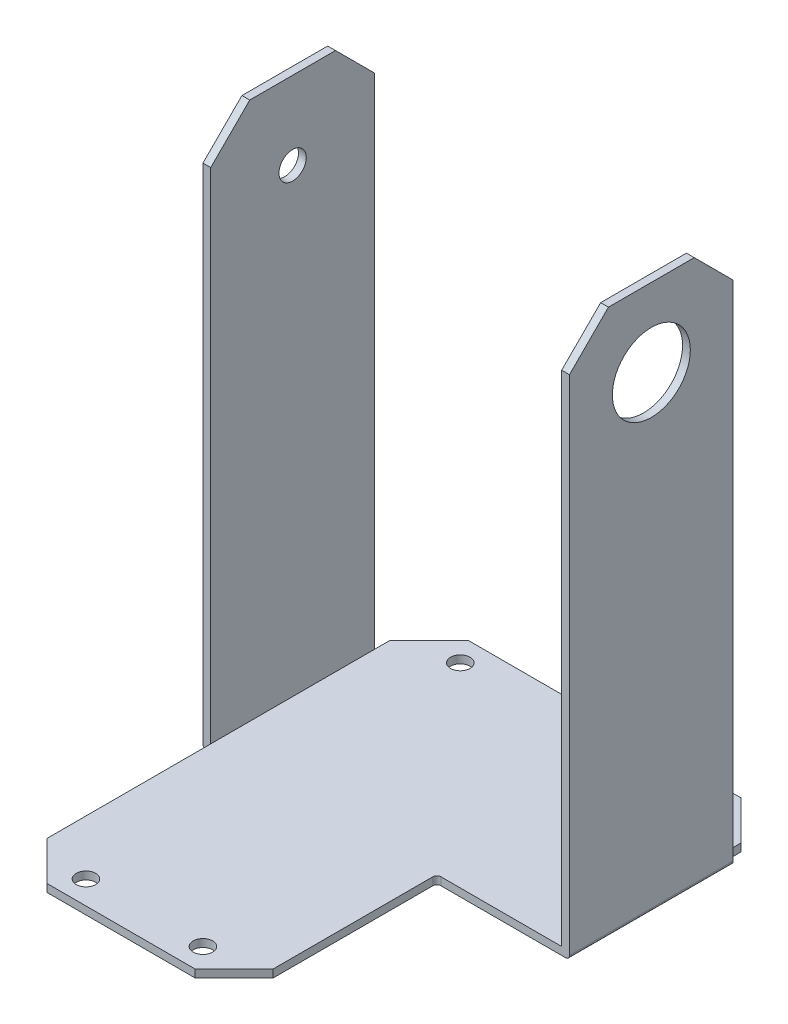
ISO-10303-21;
HEADER;
FILE_DESCRIPTION(('STEP AP214'),'2;1');
FILE_NAME('part.step','',(''),(''),'','','');
FILE_SCHEMA(('AUTOMOTIVE_DESIGN { 1 0 10303 214 1 1 1 1 }'));
ENDSEC;
DATA;
#1=APPLICATION_CONTEXT('core data for automotive mechanical design processes');
#2=APPLICATION_PROTOCOL_DEFINITION('international standard','automotive_design',2000,#1);
#3=PRODUCT_CONTEXT('',#1,'mechanical');
#4=PRODUCT('Part','Part','',(#3));
#5=PRODUCT_RELATED_PRODUCT_CATEGORY('part','',(#4));
#6=PRODUCT_DEFINITION_FORMATION('','',#4);
#7=PRODUCT_DEFINITION_CONTEXT('part definition',#1,'design');
#8=PRODUCT_DEFINITION('design','',#6,#7);
#9=PRODUCT_DEFINITION_SHAPE('','',#8);
#10=(LENGTH_UNIT() NAMED_UNIT(*) SI_UNIT(.MILLI.,.METRE.));
#11=(NAMED_UNIT(*) PLANE_ANGLE_UNIT() SI_UNIT($,.RADIAN.));
#12=(NAMED_UNIT(*) SI_UNIT($,.STERADIAN.) SOLID_ANGLE_UNIT());
#13=UNCERTAINTY_MEASURE_WITH_UNIT(LENGTH_MEASURE(1.E-05),#10,'distance_accuracy_value','');
#14=(GEOMETRIC_REPRESENTATION_CONTEXT(3) GLOBAL_UNCERTAINTY_ASSIGNED_CONTEXT((#13)) GLOBAL_UNIT_ASSIGNED_CONTEXT((#10,
#11,#12)) REPRESENTATION_CONTEXT('',''));
#15=CARTESIAN_POINT('',(0.,0.,0.));
#16=DIRECTION('',(0.,0.,1.));
#17=DIRECTION('',(1.,0.,0.));
#18=AXIS2_PLACEMENT_3D('',#15,#16,#17);
#19=CARTESIAN_POINT('',(-47.,70.,-21.));
#20=DIRECTION('',(0.,0.,1.));
#21=DIRECTION('',(1.,0.,0.));
#22=AXIS2_PLACEMENT_3D('',#19,#20,#21);
#23=PLANE('',#22);
#24=DIRECTION('',(-1.,0.,0.));
#25=VECTOR('',#24,1.);
#26=CARTESIAN_POINT('',(-47.,0.,-21.));
#27=LINE('',#26,#25);
#28=CARTESIAN_POINT('',(-46.,0.,-21.));
#29=VERTEX_POINT('',#28);
#30=CARTESIAN_POINT('',(-46.5,0.,-21.));
#31=VERTEX_POINT('',#30);
#32=EDGE_CURVE('E218',#29,#31,#27,.T.);
#33=ORIENTED_EDGE('',*,*,#32,.T.);
#34=CARTESIAN_POINT('',(-46.5,0.5,-21.));
#35=DIRECTION('',(0.,0.,1.));
#36=DIRECTION('',(1.,0.,0.));
#37=AXIS2_PLACEMENT_3D('',#34,#35,#36);
#38=CIRCLE('',#37,0.5);
#39=CARTESIAN_POINT('',(-47.,0.5,-21.));
#40=VERTEX_POINT('',#39);
#41=EDGE_CURVE('E399',#31,#40,#38,.F.);
#42=ORIENTED_EDGE('',*,*,#41,.T.);
#43=DIRECTION('',(0.,-1.,0.));
#44=VECTOR('',#43,1.);
#45=CARTESIAN_POINT('',(-47.,70.,-21.));
#46=LINE('',#45,#44);
#47=CARTESIAN_POINT('',(-47.,65.,-21.));
#48=VERTEX_POINT('',#47);
#49=EDGE_CURVE('E308',#48,#40,#46,.T.);
#50=ORIENTED_EDGE('',*,*,#49,.F.);
#51=DIRECTION('',(1.,0.,0.));
#52=VECTOR('',#51,1.);
#53=CARTESIAN_POINT('',(-47.,65.,-21.));
#54=LINE('',#53,#52);
#55=CARTESIAN_POINT('',(-46.,65.,-21.));
#56=VERTEX_POINT('',#55);
#57=EDGE_CURVE('E376',#48,#56,#54,.T.);
#58=ORIENTED_EDGE('',*,*,#57,.T.);
#59=DIRECTION('',(0.,-1.,0.));
#60=VECTOR('',#59,1.);
#61=CARTESIAN_POINT('',(-46.,70.,-21.));
#62=LINE('',#61,#60);
#63=CARTESIAN_POINT('',(-46.,1.,-21.));
#64=VERTEX_POINT('',#63);
#65=EDGE_CURVE('E280',#56,#64,#62,.T.);
#66=ORIENTED_EDGE('',*,*,#65,.T.);
#67=DIRECTION('',(0.,1.,0.));
#68=VECTOR('',#67,1.);
#69=CARTESIAN_POINT('',(-46.,0.,-21.));
#70=LINE('',#69,#68);
#71=EDGE_CURVE('E233',#29,#64,#70,.T.);
#72=ORIENTED_EDGE('',*,*,#71,.F.);
#73=EDGE_LOOP('',(#33,#42,#50,#58,#66,#72));
#74=FACE_BOUND('',#73,.T.);
#75=ADVANCED_FACE('F37',(#74),#23,.F.);
#76=DIRECTION('',(0.,-1.,0.));
#77=VECTOR('',#76,1.);
#78=CARTESIAN_POINT('',(0.,70.,-21.));
#79=LINE('',#78,#77);
#80=CARTESIAN_POINT('',(0.,65.,-21.));
#81=VERTEX_POINT('',#80);
#82=CARTESIAN_POINT('',(0.,0.5,-21.));
#83=VERTEX_POINT('',#82);
#84=EDGE_CURVE('E311',#81,#83,#79,.T.);
#85=ORIENTED_EDGE('',*,*,#84,.T.);
#86=CARTESIAN_POINT('',(-0.5,0.5,-21.));
#87=DIRECTION('',(0.,0.,1.));
#88=DIRECTION('',(1.,0.,0.));
#89=AXIS2_PLACEMENT_3D('',#86,#87,#88);
#90=CIRCLE('',#89,0.5);
#91=CARTESIAN_POINT('',(-0.5,0.,-21.));
#92=VERTEX_POINT('',#91);
#93=EDGE_CURVE('E52',#83,#92,#90,.F.);
#94=ORIENTED_EDGE('',*,*,#93,.T.);
#95=CARTESIAN_POINT('',(-1.,0.,-21.));
#96=VERTEX_POINT('',#95);
#97=EDGE_CURVE('E209',#92,#96,#27,.T.);
#98=ORIENTED_EDGE('',*,*,#97,.T.);
#99=DIRECTION('',(0.,-1.,0.));
#100=VECTOR('',#99,1.);
#101=CARTESIAN_POINT('',(-1.,1.,-21.));
#102=LINE('',#101,#100);
#103=CARTESIAN_POINT('',(-1.,1.,-21.));
#104=VERTEX_POINT('',#103);
#105=EDGE_CURVE('E215',#104,#96,#102,.T.);
#106=ORIENTED_EDGE('',*,*,#105,.F.);
#107=DIRECTION('',(0.,-1.,0.));
#108=VECTOR('',#107,1.);
#109=CARTESIAN_POINT('',(-1.,70.,-21.));
#110=LINE('',#109,#108);
#111=CARTESIAN_POINT('',(-1.,65.,-21.));
#112=VERTEX_POINT('',#111);
#113=EDGE_CURVE('E278',#112,#104,#110,.T.);
#114=ORIENTED_EDGE('',*,*,#113,.F.);
#115=DIRECTION('',(1.,0.,0.));
#116=VECTOR('',#115,1.);
#117=CARTESIAN_POINT('',(-47.,65.,-21.));
#118=LINE('',#117,#116);
#119=EDGE_CURVE('E358',#112,#81,#118,.T.);
#120=ORIENTED_EDGE('',*,*,#119,.T.);
#121=EDGE_LOOP('',(#85,#94,#98,#106,#114,#120));
#122=FACE_BOUND('',#121,.T.);
#123=ADVANCED_FACE('F212',(#122),#23,.F.);
#124=CARTESIAN_POINT('',(0.,70.,0.));
#125=DIRECTION('',(0.,0.,-1.));
#126=DIRECTION('',(-1.,0.,0.));
#127=AXIS2_PLACEMENT_3D('',#124,#125,#126);
#128=PLANE('',#127);
#129=DIRECTION('',(1.,0.,0.));
#130=VECTOR('',#129,1.);
#131=CARTESIAN_POINT('',(0.,1.,0.));
#132=LINE('',#131,#130);
#133=CARTESIAN_POINT('',(-16.5,1.,0.));
#134=VERTEX_POINT('',#133);
#135=CARTESIAN_POINT('',(-1.,1.,0.));
#136=VERTEX_POINT('',#135);
#137=EDGE_CURVE('E277',#134,#136,#132,.T.);
#138=ORIENTED_EDGE('',*,*,#137,.F.);
#139=DIRECTION('',(0.,1.,0.));
#140=VECTOR('',#139,1.);
#141=CARTESIAN_POINT('',(-16.5,0.,0.));
#142=LINE('',#141,#140);
#143=CARTESIAN_POINT('',(-16.5,0.,0.));
#144=VERTEX_POINT('',#143);
#145=EDGE_CURVE('E389',#134,#144,#142,.F.);
#146=ORIENTED_EDGE('',*,*,#145,.T.);
#147=DIRECTION('',(1.,0.,0.));
#148=VECTOR('',#147,1.);
#149=CARTESIAN_POINT('',(0.,0.,0.));
#150=LINE('',#149,#148);
#151=CARTESIAN_POINT('',(-0.5,0.,0.));
#152=VERTEX_POINT('',#151);
#153=EDGE_CURVE('E217',#144,#152,#150,.T.);
#154=ORIENTED_EDGE('',*,*,#153,.T.);
#155=CARTESIAN_POINT('',(-0.5,0.5,0.));
#156=DIRECTION('',(0.,0.,-1.));
#157=DIRECTION('',(-1.,0.,0.));
#158=AXIS2_PLACEMENT_3D('',#155,#156,#157);
#159=CIRCLE('',#158,0.5);
#160=CARTESIAN_POINT('',(0.,0.5,0.));
#161=VERTEX_POINT('',#160);
#162=EDGE_CURVE('E387',#152,#161,#159,.F.);
#163=ORIENTED_EDGE('',*,*,#162,.T.);
#164=DIRECTION('',(0.,-1.,0.));
#165=VECTOR('',#164,1.);
#166=CARTESIAN_POINT('',(0.,70.,0.));
#167=LINE('',#166,#165);
#168=CARTESIAN_POINT('',(0.,65.,0.));
#169=VERTEX_POINT('',#168);
#170=EDGE_CURVE('E300',#169,#161,#167,.T.);
#171=ORIENTED_EDGE('',*,*,#170,.F.);
#172=DIRECTION('',(-1.,0.,0.));
#173=VECTOR('',#172,1.);
#174=CARTESIAN_POINT('',(0.,65.,0.));
#175=LINE('',#174,#173);
#176=CARTESIAN_POINT('',(-1.,65.,0.));
#177=VERTEX_POINT('',#176);
#178=EDGE_CURVE('E364',#169,#177,#175,.T.);
#179=ORIENTED_EDGE('',*,*,#178,.T.);
#180=DIRECTION('',(0.,-1.,0.));
#181=VECTOR('',#180,1.);
#182=CARTESIAN_POINT('',(-1.,70.,0.));
#183=LINE('',#182,#181);
#184=EDGE_CURVE('E286',#177,#136,#183,.T.);
#185=ORIENTED_EDGE('',*,*,#184,.T.);
#186=EDGE_LOOP('',(#138,#146,#154,#163,#171,#179,#185));
#187=FACE_BOUND('',#186,.T.);
#188=ADVANCED_FACE('F411',(#187),#128,.F.);
#189=DIRECTION('',(0.,-1.,0.));
#190=VECTOR('',#189,1.);
#191=CARTESIAN_POINT('',(-47.,70.,0.));
#192=LINE('',#191,#190);
#193=CARTESIAN_POINT('',(-47.,65.,0.));
#194=VERTEX_POINT('',#193);
#195=CARTESIAN_POINT('',(-47.,0.5,0.));
#196=VERTEX_POINT('',#195);
#197=EDGE_CURVE('E305',#194,#196,#192,.T.);
#198=ORIENTED_EDGE('',*,*,#197,.T.);
#199=CARTESIAN_POINT('',(-46.5,0.5,0.));
#200=DIRECTION('',(0.,0.,-1.));
#201=DIRECTION('',(-1.,0.,0.));
#202=AXIS2_PLACEMENT_3D('',#199,#200,#201);
#203=CIRCLE('',#202,0.5);
#204=CARTESIAN_POINT('',(-46.5,0.,0.));
#205=VERTEX_POINT('',#204);
#206=EDGE_CURVE('E394',#196,#205,#203,.F.);
#207=ORIENTED_EDGE('',*,*,#206,.T.);
#208=CARTESIAN_POINT('',(-46.,0.,0.));
#209=VERTEX_POINT('',#208);
#210=EDGE_CURVE('E298',#205,#209,#150,.T.);
#211=ORIENTED_EDGE('',*,*,#210,.T.);
#212=DIRECTION('',(0.,-1.,0.));
#213=VECTOR('',#212,1.);
#214=CARTESIAN_POINT('',(-46.,1.,0.));
#215=LINE('',#214,#213);
#216=CARTESIAN_POINT('',(-46.,1.,0.));
#217=VERTEX_POINT('',#216);
#218=EDGE_CURVE('E251',#217,#209,#215,.T.);
#219=ORIENTED_EDGE('',*,*,#218,.F.);
#220=DIRECTION('',(0.,-1.,0.));
#221=VECTOR('',#220,1.);
#222=CARTESIAN_POINT('',(-46.,70.,0.));
#223=LINE('',#222,#221);
#224=CARTESIAN_POINT('',(-46.,65.,0.));
#225=VERTEX_POINT('',#224);
#226=EDGE_CURVE('E282',#225,#217,#223,.T.);
#227=ORIENTED_EDGE('',*,*,#226,.F.);
#228=DIRECTION('',(-1.,0.,0.));
#229=VECTOR('',#228,1.);
#230=CARTESIAN_POINT('',(0.,65.,0.));
#231=LINE('',#230,#229);
#232=EDGE_CURVE('E382',#225,#194,#231,.T.);
#233=ORIENTED_EDGE('',*,*,#232,.T.);
#234=EDGE_LOOP('',(#198,#207,#211,#219,#227,#233));
#235=FACE_BOUND('',#234,.T.);
#236=ADVANCED_FACE('F442',(#235),#128,.F.);
#237=CARTESIAN_POINT('',(0.,70.,0.));
#238=DIRECTION('',(0.,-1.,0.));
#239=DIRECTION('',(0.,0.,-1.));
#240=AXIS2_PLACEMENT_3D('',#237,#238,#239);
#241=PLANE('',#240);
#242=DIRECTION('',(0.,0.,-1.));
#243=VECTOR('',#242,1.);
#244=CARTESIAN_POINT('',(0.,70.,-21.));
#245=LINE('',#244,#243);
#246=CARTESIAN_POINT('',(0.,70.,-5.));
#247=VERTEX_POINT('',#246);
#248=CARTESIAN_POINT('',(0.,70.,-16.));
#249=VERTEX_POINT('',#248);
#250=EDGE_CURVE('E294',#247,#249,#245,.T.);
#251=ORIENTED_EDGE('',*,*,#250,.T.);
#252=DIRECTION('',(-1.,0.,0.));
#253=VECTOR('',#252,1.);
#254=CARTESIAN_POINT('',(0.,70.,-16.));
#255=LINE('',#254,#253);
#256=CARTESIAN_POINT('',(-1.,70.,-16.));
#257=VERTEX_POINT('',#256);
#258=EDGE_CURVE('E351',#249,#257,#255,.T.);
#259=ORIENTED_EDGE('',*,*,#258,.T.);
#260=DIRECTION('',(0.,0.,-1.));
#261=VECTOR('',#260,1.);
#262=CARTESIAN_POINT('',(-1.,70.,0.));
#263=LINE('',#262,#261);
#264=CARTESIAN_POINT('',(-1.,70.,-5.));
#265=VERTEX_POINT('',#264);
#266=EDGE_CURVE('E287',#265,#257,#263,.T.);
#267=ORIENTED_EDGE('',*,*,#266,.F.);
#268=DIRECTION('',(1.,0.,0.));
#269=VECTOR('',#268,1.);
#270=CARTESIAN_POINT('',(0.,70.,-5.));
#271=LINE('',#270,#269);
#272=EDGE_CURVE('E348',#265,#247,#271,.T.);
#273=ORIENTED_EDGE('',*,*,#272,.T.);
#274=EDGE_LOOP('',(#251,#259,#267,#273));
#275=FACE_BOUND('',#274,.T.);
#276=ADVANCED_FACE('F595',(#275),#241,.F.);
#277=DIRECTION('',(0.,0.,1.));
#278=VECTOR('',#277,1.);
#279=CARTESIAN_POINT('',(-46.,70.,0.));
#280=LINE('',#279,#278);
#281=CARTESIAN_POINT('',(-46.,70.,-16.));
#282=VERTEX_POINT('',#281);
#283=CARTESIAN_POINT('',(-46.,70.,-5.));
#284=VERTEX_POINT('',#283);
#285=EDGE_CURVE('E283',#282,#284,#280,.T.);
#286=ORIENTED_EDGE('',*,*,#285,.F.);
#287=DIRECTION('',(-1.,0.,0.));
#288=VECTOR('',#287,1.);
#289=CARTESIAN_POINT('',(0.,70.,-16.));
#290=LINE('',#289,#288);
#291=CARTESIAN_POINT('',(-47.,70.,-16.));
#292=VERTEX_POINT('',#291);
#293=EDGE_CURVE('E369',#282,#292,#290,.T.);
#294=ORIENTED_EDGE('',*,*,#293,.T.);
#295=DIRECTION('',(0.,0.,1.));
#296=VECTOR('',#295,1.);
#297=CARTESIAN_POINT('',(-47.,70.,0.));
#298=LINE('',#297,#296);
#299=CARTESIAN_POINT('',(-47.,70.,-5.));
#300=VERTEX_POINT('',#299);
#301=EDGE_CURVE('E297',#292,#300,#298,.T.);
#302=ORIENTED_EDGE('',*,*,#301,.T.);
#303=DIRECTION('',(1.,0.,0.));
#304=VECTOR('',#303,1.);
#305=CARTESIAN_POINT('',(0.,70.,-5.));
#306=LINE('',#305,#304);
#307=EDGE_CURVE('E366',#300,#284,#306,.T.);
#308=ORIENTED_EDGE('',*,*,#307,.T.);
#309=EDGE_LOOP('',(#286,#294,#302,#308));
#310=FACE_BOUND('',#309,.T.);
#311=ADVANCED_FACE('F548',(#310),#241,.F.);
#312=CARTESIAN_POINT('',(0.,70.,-21.));
#313=DIRECTION('',(-1.,0.,0.));
#314=DIRECTION('',(0.,0.,1.));
#315=AXIS2_PLACEMENT_3D('',#312,#313,#314);
#316=PLANE('',#315);
#317=CARTESIAN_POINT('',(0.,60.,-10.5));
#318=DIRECTION('',(1.,0.,0.));
#319=DIRECTION('',(0.,0.,-1.));
#320=AXIS2_PLACEMENT_3D('',#317,#318,#319);
#321=CIRCLE('',#320,5.);
#322=CARTESIAN_POINT('',(0.,60.,-15.5));
#323=VERTEX_POINT('',#322);
#324=EDGE_CURVE('E240',#323,#323,#321,.T.);
#325=ORIENTED_EDGE('',*,*,#324,.F.);
#326=EDGE_LOOP('',(#325));
#327=FACE_BOUND('',#326,.T.);
#328=ORIENTED_EDGE('',*,*,#170,.T.);
#329=DIRECTION('',(0.,0.,-1.));
#330=VECTOR('',#329,1.);
#331=CARTESIAN_POINT('',(0.,0.5,-21.));
#332=LINE('',#331,#330);
#333=EDGE_CURVE('E401',#161,#83,#332,.T.);
#334=ORIENTED_EDGE('',*,*,#333,.T.);
#335=ORIENTED_EDGE('',*,*,#84,.F.);
#336=DIRECTION('',(0.,-0.707106781186549,-0.707106781186547));
#337=VECTOR('',#336,1.);
#338=CARTESIAN_POINT('',(0.,70.,-16.));
#339=LINE('',#338,#337);
#340=EDGE_CURVE('E362',#81,#249,#339,.F.);
#341=ORIENTED_EDGE('',*,*,#340,.T.);
#342=ORIENTED_EDGE('',*,*,#250,.F.);
#343=DIRECTION('',(0.,0.707106781186549,-0.707106781186547));
#344=VECTOR('',#343,1.);
#345=CARTESIAN_POINT('',(0.,70.,-5.));
#346=LINE('',#345,#344);
#347=EDGE_CURVE('E360',#247,#169,#346,.F.);
#348=ORIENTED_EDGE('',*,*,#347,.T.);
#349=EDGE_LOOP('',(#328,#334,#335,#341,#342,#348));
#350=FACE_BOUND('',#349,.T.);
#351=ADVANCED_FACE('F533',(#327,#350),#316,.F.);
#352=CARTESIAN_POINT('',(-47.,70.,0.));
#353=DIRECTION('',(1.,0.,0.));
#354=DIRECTION('',(0.,0.,-1.));
#355=AXIS2_PLACEMENT_3D('',#352,#353,#354);
#356=PLANE('',#355);
#357=CARTESIAN_POINT('',(-47.,60.,-10.5));
#358=DIRECTION('',(-1.,0.,0.));
#359=DIRECTION('',(0.,0.,1.));
#360=AXIS2_PLACEMENT_3D('',#357,#358,#359);
#361=CIRCLE('',#360,1.75);
#362=CARTESIAN_POINT('',(-47.,60.,-8.74999999999999));
#363=VERTEX_POINT('',#362);
#364=EDGE_CURVE('E474',#363,#363,#361,.T.);
#365=ORIENTED_EDGE('',*,*,#364,.F.);
#366=EDGE_LOOP('',(#365));
#367=FACE_BOUND('',#366,.T.);
#368=ORIENTED_EDGE('',*,*,#49,.T.);
#369=DIRECTION('',(0.,0.,1.));
#370=VECTOR('',#369,1.);
#371=CARTESIAN_POINT('',(-47.,0.5,0.));
#372=LINE('',#371,#370);
#373=EDGE_CURVE('E391',#40,#196,#372,.T.);
#374=ORIENTED_EDGE('',*,*,#373,.T.);
#375=ORIENTED_EDGE('',*,*,#197,.F.);
#376=DIRECTION('',(0.,-0.707106781186549,0.707106781186547));
#377=VECTOR('',#376,1.);
#378=CARTESIAN_POINT('',(-47.,70.,-5.));
#379=LINE('',#378,#377);
#380=EDGE_CURVE('E372',#194,#300,#379,.F.);
#381=ORIENTED_EDGE('',*,*,#380,.T.);
#382=ORIENTED_EDGE('',*,*,#301,.F.);
#383=DIRECTION('',(0.,0.707106781186549,0.707106781186547));
#384=VECTOR('',#383,1.);
#385=CARTESIAN_POINT('',(-47.,70.,-16.));
#386=LINE('',#385,#384);
#387=EDGE_CURVE('E374',#292,#48,#386,.F.);
#388=ORIENTED_EDGE('',*,*,#387,.T.);
#389=EDGE_LOOP('',(#368,#374,#375,#381,#382,#388));
#390=FACE_BOUND('',#389,.T.);
#391=ADVANCED_FACE('F524',(#367,#390),#356,.F.);
#392=CARTESIAN_POINT('',(0.,0.,0.));
#393=DIRECTION('',(0.,-1.,0.));
#394=DIRECTION('',(0.,0.,-1.));
#395=AXIS2_PLACEMENT_3D('',#392,#393,#394);
#396=PLANE('',#395);
#397=CARTESIAN_POINT('',(-39.,0.,23.));
#398=DIRECTION('',(0.,-1.,0.));
#399=DIRECTION('',(0.,0.,-1.));
#400=AXIS2_PLACEMENT_3D('',#397,#398,#399);
#401=CIRCLE('',#400,1.25);
#402=CARTESIAN_POINT('',(-39.,0.,21.75));
#403=VERTEX_POINT('',#402);
#404=EDGE_CURVE('E495',#403,#403,#401,.T.);
#405=ORIENTED_EDGE('',*,*,#404,.F.);
#406=EDGE_LOOP('',(#405));
#407=FACE_BOUND('',#406,.T.);
#408=CARTESIAN_POINT('',(-24.,0.,23.));
#409=DIRECTION('',(0.,-1.,0.));
#410=DIRECTION('',(0.,0.,-1.));
#411=AXIS2_PLACEMENT_3D('',#408,#409,#410);
#412=CIRCLE('',#411,1.25);
#413=CARTESIAN_POINT('',(-24.,0.,21.75));
#414=VERTEX_POINT('',#413);
#415=EDGE_CURVE('E489',#414,#414,#412,.T.);
#416=ORIENTED_EDGE('',*,*,#415,.F.);
#417=EDGE_LOOP('',(#416));
#418=FACE_BOUND('',#417,.T.);
#419=CARTESIAN_POINT('',(-24.,0.,-25.));
#420=DIRECTION('',(0.,-1.,0.));
#421=DIRECTION('',(0.,0.,-1.));
#422=AXIS2_PLACEMENT_3D('',#419,#420,#421);
#423=CIRCLE('',#422,1.25);
#424=CARTESIAN_POINT('',(-24.,0.,-26.25));
#425=VERTEX_POINT('',#424);
#426=EDGE_CURVE('E483',#425,#425,#423,.T.);
#427=ORIENTED_EDGE('',*,*,#426,.F.);
#428=EDGE_LOOP('',(#427));
#429=FACE_BOUND('',#428,.T.);
#430=CARTESIAN_POINT('',(-39.,0.,-25.));
#431=DIRECTION('',(0.,-1.,0.));
#432=DIRECTION('',(0.,0.,-1.));
#433=AXIS2_PLACEMENT_3D('',#430,#431,#432);
#434=CIRCLE('',#433,1.25);
#435=CARTESIAN_POINT('',(-39.,0.,-26.25));
#436=VERTEX_POINT('',#435);
#437=EDGE_CURVE('E477',#436,#436,#434,.T.);
#438=ORIENTED_EDGE('',*,*,#437,.F.);
#439=EDGE_LOOP('',(#438));
#440=FACE_BOUND('',#439,.T.);
#441=ORIENTED_EDGE('',*,*,#210,.F.);
#442=DIRECTION('',(0.,0.,1.));
#443=VECTOR('',#442,1.);
#444=CARTESIAN_POINT('',(-46.5,0.,-21.));
#445=LINE('',#444,#443);
#446=EDGE_CURVE('E60',#205,#31,#445,.F.);
#447=ORIENTED_EDGE('',*,*,#446,.T.);
#448=ORIENTED_EDGE('',*,*,#32,.F.);
#449=DIRECTION('',(0.,0.,1.));
#450=VECTOR('',#449,1.);
#451=CARTESIAN_POINT('',(-46.,0.,-28.));
#452=LINE('',#451,#450);
#453=CARTESIAN_POINT('',(-46.,0.,-23.));
#454=VERTEX_POINT('',#453);
#455=EDGE_CURVE('E228',#454,#29,#452,.T.);
#456=ORIENTED_EDGE('',*,*,#455,.F.);
#457=DIRECTION('',(0.707106781186547,0.,-0.707106781186549));
#458=VECTOR('',#457,1.);
#459=CARTESIAN_POINT('',(-34.5000000000001,0.,-34.5));
#460=LINE('',#459,#458);
#461=CARTESIAN_POINT('',(-41.,0.,-28.));
#462=VERTEX_POINT('',#461);
#463=EDGE_CURVE('E323',#454,#462,#460,.T.);
#464=ORIENTED_EDGE('',*,*,#463,.T.);
#465=DIRECTION('',(-1.,0.,0.));
#466=VECTOR('',#465,1.);
#467=CARTESIAN_POINT('',(-1.,0.,-28.));
#468=LINE('',#467,#466);
#469=CARTESIAN_POINT('',(-6.00000000000002,0.,-28.));
#470=VERTEX_POINT('',#469);
#471=EDGE_CURVE('E243',#470,#462,#468,.T.);
#472=ORIENTED_EDGE('',*,*,#471,.F.);
#473=DIRECTION('',(0.707106781186548,0.,0.707106781186548));
#474=VECTOR('',#473,1.);
#475=CARTESIAN_POINT('',(11.,0.,-11.));
#476=LINE('',#475,#474);
#477=CARTESIAN_POINT('',(-1.,0.,-23.));
#478=VERTEX_POINT('',#477);
#479=EDGE_CURVE('E224',#470,#478,#476,.T.);
#480=ORIENTED_EDGE('',*,*,#479,.T.);
#481=DIRECTION('',(0.,0.,1.));
#482=VECTOR('',#481,1.);
#483=CARTESIAN_POINT('',(-1.,0.,-28.));
#484=LINE('',#483,#482);
#485=EDGE_CURVE('E221',#478,#96,#484,.T.);
#486=ORIENTED_EDGE('',*,*,#485,.T.);
#487=ORIENTED_EDGE('',*,*,#97,.F.);
#488=DIRECTION('',(0.,0.,-1.));
#489=VECTOR('',#488,1.);
#490=CARTESIAN_POINT('',(-0.5,0.,0.));
#491=LINE('',#490,#489);
#492=EDGE_CURVE('E396',#92,#152,#491,.F.);
#493=ORIENTED_EDGE('',*,*,#492,.T.);
#494=ORIENTED_EDGE('',*,*,#153,.F.);
#495=CARTESIAN_POINT('',(-16.5,0.,0.5));
#496=DIRECTION('',(0.,-1.,0.));
#497=DIRECTION('',(0.,0.,-1.));
#498=AXIS2_PLACEMENT_3D('',#495,#496,#497);
#499=CIRCLE('',#498,0.5);
#500=CARTESIAN_POINT('',(-17.,0.,0.500000000000007));
#501=VERTEX_POINT('',#500);
#502=EDGE_CURVE('E11',#144,#501,#499,.F.);
#503=ORIENTED_EDGE('',*,*,#502,.T.);
#504=DIRECTION('',(0.,0.,-1.));
#505=VECTOR('',#504,1.);
#506=CARTESIAN_POINT('',(-17.,0.,26.));
#507=LINE('',#506,#505);
#508=CARTESIAN_POINT('',(-17.,0.,21.));
#509=VERTEX_POINT('',#508);
#510=EDGE_CURVE('E263',#509,#501,#507,.T.);
#511=ORIENTED_EDGE('',*,*,#510,.F.);
#512=DIRECTION('',(-0.707106781186547,0.,0.707106781186548));
#513=VECTOR('',#512,1.);
#514=CARTESIAN_POINT('',(1.99999999999999,0.,1.99999999999998));
#515=LINE('',#514,#513);
#516=CARTESIAN_POINT('',(-22.,0.,26.));
#517=VERTEX_POINT('',#516);
#518=EDGE_CURVE('E319',#509,#517,#515,.T.);
#519=ORIENTED_EDGE('',*,*,#518,.T.);
#520=DIRECTION('',(1.,0.,0.));
#521=VECTOR('',#520,1.);
#522=CARTESIAN_POINT('',(-46.,0.,26.));
#523=LINE('',#522,#521);
#524=CARTESIAN_POINT('',(-41.,0.,26.));
#525=VERTEX_POINT('',#524);
#526=EDGE_CURVE('E255',#525,#517,#523,.T.);
#527=ORIENTED_EDGE('',*,*,#526,.F.);
#528=DIRECTION('',(-0.707106781186547,0.,-0.707106781186549));
#529=VECTOR('',#528,1.);
#530=CARTESIAN_POINT('',(-33.5000000000001,0.,33.5));
#531=LINE('',#530,#529);
#532=CARTESIAN_POINT('',(-46.,0.,21.));
#533=VERTEX_POINT('',#532);
#534=EDGE_CURVE('E321',#525,#533,#531,.T.);
#535=ORIENTED_EDGE('',*,*,#534,.T.);
#536=DIRECTION('',(0.,0.,-1.));
#537=VECTOR('',#536,1.);
#538=CARTESIAN_POINT('',(-46.,0.,26.));
#539=LINE('',#538,#537);
#540=EDGE_CURVE('E266',#533,#209,#539,.T.);
#541=ORIENTED_EDGE('',*,*,#540,.T.);
#542=EDGE_LOOP('',(#441,#447,#448,#456,#464,#472,#480,#486,#487,#493,#494,#503,#511,#519,#527,
#535,#541));
#543=FACE_BOUND('',#542,.T.);
#544=ADVANCED_FACE('F222',(#407,#418,#429,#440,#543),#396,.T.);
#545=CARTESIAN_POINT('',(-1.,70.,-21.));
#546=DIRECTION('',(-1.,0.,0.));
#547=DIRECTION('',(0.,0.,1.));
#548=AXIS2_PLACEMENT_3D('',#545,#546,#547);
#549=PLANE('',#548);
#550=CARTESIAN_POINT('',(-1.,60.,-10.5));
#551=DIRECTION('',(-1.,0.,0.));
#552=DIRECTION('',(0.,0.,1.));
#553=AXIS2_PLACEMENT_3D('',#550,#551,#552);
#554=CIRCLE('',#553,5.);
#555=CARTESIAN_POINT('',(-1.,60.,-5.5));
#556=VERTEX_POINT('',#555);
#557=EDGE_CURVE('E234',#556,#556,#554,.T.);
#558=ORIENTED_EDGE('',*,*,#557,.F.);
#559=EDGE_LOOP('',(#558));
#560=FACE_BOUND('',#559,.T.);
#561=ORIENTED_EDGE('',*,*,#266,.T.);
#562=DIRECTION('',(0.,0.707106781186549,0.707106781186547));
#563=VECTOR('',#562,1.);
#564=CARTESIAN_POINT('',(-1.,67.5,-18.5));
#565=LINE('',#564,#563);
#566=EDGE_CURVE('E356',#257,#112,#565,.F.);
#567=ORIENTED_EDGE('',*,*,#566,.T.);
#568=ORIENTED_EDGE('',*,*,#113,.T.);
#569=DIRECTION('',(0.,0.,-1.));
#570=VECTOR('',#569,1.);
#571=CARTESIAN_POINT('',(-1.,1.,0.));
#572=LINE('',#571,#570);
#573=EDGE_CURVE('E272',#136,#104,#572,.T.);
#574=ORIENTED_EDGE('',*,*,#573,.F.);
#575=ORIENTED_EDGE('',*,*,#184,.F.);
#576=DIRECTION('',(0.,-0.707106781186549,0.707106781186547));
#577=VECTOR('',#576,1.);
#578=CARTESIAN_POINT('',(-1.,78.,-13.));
#579=LINE('',#578,#577);
#580=EDGE_CURVE('E354',#177,#265,#579,.F.);
#581=ORIENTED_EDGE('',*,*,#580,.T.);
#582=EDGE_LOOP('',(#561,#567,#568,#574,#575,#581));
#583=FACE_BOUND('',#582,.T.);
#584=ADVANCED_FACE('F523',(#560,#583),#549,.T.);
#585=CARTESIAN_POINT('',(-46.,70.,0.));
#586=DIRECTION('',(1.,0.,0.));
#587=DIRECTION('',(0.,0.,-1.));
#588=AXIS2_PLACEMENT_3D('',#585,#586,#587);
#589=PLANE('',#588);
#590=CARTESIAN_POINT('',(-46.,60.,-10.5));
#591=DIRECTION('',(1.,0.,0.));
#592=DIRECTION('',(0.,0.,-1.));
#593=AXIS2_PLACEMENT_3D('',#590,#591,#592);
#594=CIRCLE('',#593,1.75);
#595=CARTESIAN_POINT('',(-46.,60.,-12.25));
#596=VERTEX_POINT('',#595);
#597=EDGE_CURVE('E471',#596,#596,#594,.T.);
#598=ORIENTED_EDGE('',*,*,#597,.F.);
#599=EDGE_LOOP('',(#598));
#600=FACE_BOUND('',#599,.T.);
#601=ORIENTED_EDGE('',*,*,#65,.F.);
#602=DIRECTION('',(0.,-0.707106781186549,-0.707106781186547));
#603=VECTOR('',#602,1.);
#604=CARTESIAN_POINT('',(-46.,78.,-8.00000000000001));
#605=LINE('',#604,#603);
#606=EDGE_CURVE('E380',#56,#282,#605,.F.);
#607=ORIENTED_EDGE('',*,*,#606,.T.);
#608=ORIENTED_EDGE('',*,*,#285,.T.);
#609=DIRECTION('',(0.,0.707106781186549,-0.707106781186547));
#610=VECTOR('',#609,1.);
#611=CARTESIAN_POINT('',(-46.,67.5,-2.50000000000001));
#612=LINE('',#611,#610);
#613=EDGE_CURVE('E378',#284,#225,#612,.F.);
#614=ORIENTED_EDGE('',*,*,#613,.T.);
#615=ORIENTED_EDGE('',*,*,#226,.T.);
#616=DIRECTION('',(0.,0.,1.));
#617=VECTOR('',#616,1.);
#618=CARTESIAN_POINT('',(-46.,1.,0.));
#619=LINE('',#618,#617);
#620=EDGE_CURVE('E274',#64,#217,#619,.T.);
#621=ORIENTED_EDGE('',*,*,#620,.F.);
#622=EDGE_LOOP('',(#601,#607,#608,#614,#615,#621));
#623=FACE_BOUND('',#622,.T.);
#624=ADVANCED_FACE('F448',(#600,#623),#589,.T.);
#625=CARTESIAN_POINT('',(0.,1.,0.));
#626=DIRECTION('',(0.,-1.,0.));
#627=DIRECTION('',(0.,0.,-1.));
#628=AXIS2_PLACEMENT_3D('',#625,#626,#627);
#629=PLANE('',#628);
#630=CARTESIAN_POINT('',(-39.,1.,23.));
#631=DIRECTION('',(0.,1.,0.));
#632=DIRECTION('',(0.,0.,1.));
#633=AXIS2_PLACEMENT_3D('',#630,#631,#632);
#634=CIRCLE('',#633,1.25);
#635=CARTESIAN_POINT('',(-39.,1.,24.25));
#636=VERTEX_POINT('',#635);
#637=EDGE_CURVE('E498',#636,#636,#634,.T.);
#638=ORIENTED_EDGE('',*,*,#637,.F.);
#639=EDGE_LOOP('',(#638));
#640=FACE_BOUND('',#639,.T.);
#641=CARTESIAN_POINT('',(-24.,1.,23.));
#642=DIRECTION('',(0.,1.,0.));
#643=DIRECTION('',(0.,0.,1.));
#644=AXIS2_PLACEMENT_3D('',#641,#642,#643);
#645=CIRCLE('',#644,1.25);
#646=CARTESIAN_POINT('',(-24.,1.,24.25));
#647=VERTEX_POINT('',#646);
#648=EDGE_CURVE('E492',#647,#647,#645,.T.);
#649=ORIENTED_EDGE('',*,*,#648,.F.);
#650=EDGE_LOOP('',(#649));
#651=FACE_BOUND('',#650,.T.);
#652=CARTESIAN_POINT('',(-24.,1.,-25.));
#653=DIRECTION('',(0.,1.,0.));
#654=DIRECTION('',(0.,0.,1.));
#655=AXIS2_PLACEMENT_3D('',#652,#653,#654);
#656=CIRCLE('',#655,1.25);
#657=CARTESIAN_POINT('',(-24.,1.,-23.75));
#658=VERTEX_POINT('',#657);
#659=EDGE_CURVE('E486',#658,#658,#656,.T.);
#660=ORIENTED_EDGE('',*,*,#659,.F.);
#661=EDGE_LOOP('',(#660));
#662=FACE_BOUND('',#661,.T.);
#663=CARTESIAN_POINT('',(-39.,1.,-25.));
#664=DIRECTION('',(0.,1.,0.));
#665=DIRECTION('',(0.,0.,1.));
#666=AXIS2_PLACEMENT_3D('',#663,#664,#665);
#667=CIRCLE('',#666,1.25);
#668=CARTESIAN_POINT('',(-39.,1.,-23.75));
#669=VERTEX_POINT('',#668);
#670=EDGE_CURVE('E480',#669,#669,#667,.T.);
#671=ORIENTED_EDGE('',*,*,#670,.F.);
#672=EDGE_LOOP('',(#671));
#673=FACE_BOUND('',#672,.T.);
#674=DIRECTION('',(0.,0.,1.));
#675=VECTOR('',#674,1.);
#676=CARTESIAN_POINT('',(-1.,1.,-28.));
#677=LINE('',#676,#675);
#678=CARTESIAN_POINT('',(-1.,1.,-23.));
#679=VERTEX_POINT('',#678);
#680=EDGE_CURVE('E227',#679,#104,#677,.T.);
#681=ORIENTED_EDGE('',*,*,#680,.F.);
#682=DIRECTION('',(-0.707106781186548,0.,-0.707106781186548));
#683=VECTOR('',#682,1.);
#684=CARTESIAN_POINT('',(-6.00000000000002,1.,-28.));
#685=LINE('',#684,#683);
#686=CARTESIAN_POINT('',(-6.00000000000003,1.,-28.));
#687=VERTEX_POINT('',#686);
#688=EDGE_CURVE('E334',#679,#687,#685,.T.);
#689=ORIENTED_EDGE('',*,*,#688,.T.);
#690=DIRECTION('',(1.,0.,0.));
#691=VECTOR('',#690,1.);
#692=CARTESIAN_POINT('',(-46.,1.,-28.));
#693=LINE('',#692,#691);
#694=CARTESIAN_POINT('',(-41.,1.,-28.));
#695=VERTEX_POINT('',#694);
#696=EDGE_CURVE('E237',#695,#687,#693,.T.);
#697=ORIENTED_EDGE('',*,*,#696,.F.);
#698=DIRECTION('',(-0.707106781186547,0.,0.707106781186549));
#699=VECTOR('',#698,1.);
#700=CARTESIAN_POINT('',(-41.,1.,-28.));
#701=LINE('',#700,#699);
#702=CARTESIAN_POINT('',(-46.,1.,-23.));
#703=VERTEX_POINT('',#702);
#704=EDGE_CURVE('E332',#695,#703,#701,.T.);
#705=ORIENTED_EDGE('',*,*,#704,.T.);
#706=DIRECTION('',(0.,0.,1.));
#707=VECTOR('',#706,1.);
#708=CARTESIAN_POINT('',(-46.,1.,-28.));
#709=LINE('',#708,#707);
#710=EDGE_CURVE('E246',#703,#64,#709,.T.);
#711=ORIENTED_EDGE('',*,*,#710,.T.);
#712=ORIENTED_EDGE('',*,*,#620,.T.);
#713=DIRECTION('',(0.,0.,-1.));
#714=VECTOR('',#713,1.);
#715=CARTESIAN_POINT('',(-46.,1.,26.));
#716=LINE('',#715,#714);
#717=CARTESIAN_POINT('',(-46.,1.,21.));
#718=VERTEX_POINT('',#717);
#719=EDGE_CURVE('E269',#718,#217,#716,.T.);
#720=ORIENTED_EDGE('',*,*,#719,.F.);
#721=DIRECTION('',(0.707106781186547,0.,0.707106781186549));
#722=VECTOR('',#721,1.);
#723=CARTESIAN_POINT('',(-41.,1.,26.));
#724=LINE('',#723,#722);
#725=CARTESIAN_POINT('',(-41.,1.,26.));
#726=VERTEX_POINT('',#725);
#727=EDGE_CURVE('E330',#718,#726,#724,.T.);
#728=ORIENTED_EDGE('',*,*,#727,.T.);
#729=DIRECTION('',(-1.,0.,0.));
#730=VECTOR('',#729,1.);
#731=CARTESIAN_POINT('',(-17.,1.,26.));
#732=LINE('',#731,#730);
#733=CARTESIAN_POINT('',(-22.,1.,26.));
#734=VERTEX_POINT('',#733);
#735=EDGE_CURVE('E252',#734,#726,#732,.T.);
#736=ORIENTED_EDGE('',*,*,#735,.F.);
#737=DIRECTION('',(0.707106781186547,0.,-0.707106781186548));
#738=VECTOR('',#737,1.);
#739=CARTESIAN_POINT('',(-22.,1.,26.));
#740=LINE('',#739,#738);
#741=CARTESIAN_POINT('',(-17.,1.,21.));
#742=VERTEX_POINT('',#741);
#743=EDGE_CURVE('E328',#734,#742,#740,.T.);
#744=ORIENTED_EDGE('',*,*,#743,.T.);
#745=DIRECTION('',(0.,0.,-1.));
#746=VECTOR('',#745,1.);
#747=CARTESIAN_POINT('',(-17.,1.,26.));
#748=LINE('',#747,#746);
#749=CARTESIAN_POINT('',(-17.,1.,0.500000000000007));
#750=VERTEX_POINT('',#749);
#751=EDGE_CURVE('E258',#742,#750,#748,.T.);
#752=ORIENTED_EDGE('',*,*,#751,.T.);
#753=CARTESIAN_POINT('',(-16.5,1.,0.5));
#754=DIRECTION('',(0.,-1.,0.));
#755=DIRECTION('',(0.,0.,-1.));
#756=AXIS2_PLACEMENT_3D('',#753,#754,#755);
#757=CIRCLE('',#756,0.5);
#758=EDGE_CURVE('E45',#750,#134,#757,.T.);
#759=ORIENTED_EDGE('',*,*,#758,.T.);
#760=ORIENTED_EDGE('',*,*,#137,.T.);
#761=ORIENTED_EDGE('',*,*,#573,.T.);
#762=EDGE_LOOP('',(#681,#689,#697,#705,#711,#712,#720,#728,#736,#744,#752,#759,#760,#761));
#763=FACE_BOUND('',#762,.T.);
#764=ADVANCED_FACE('F405',(#640,#651,#662,#673,#763),#629,.F.);
#765=CARTESIAN_POINT('',(-46.,1.,26.));
#766=DIRECTION('',(1.,0.,0.));
#767=DIRECTION('',(0.,0.,-1.));
#768=AXIS2_PLACEMENT_3D('',#765,#766,#767);
#769=PLANE('',#768);
#770=ORIENTED_EDGE('',*,*,#540,.F.);
#771=DIRECTION('',(0.,1.,0.));
#772=VECTOR('',#771,1.);
#773=CARTESIAN_POINT('',(-46.,1.,21.));
#774=LINE('',#773,#772);
#775=EDGE_CURVE('E344',#533,#718,#774,.T.);
#776=ORIENTED_EDGE('',*,*,#775,.T.);
#777=ORIENTED_EDGE('',*,*,#719,.T.);
#778=ORIENTED_EDGE('',*,*,#218,.T.);
#779=EDGE_LOOP('',(#770,#776,#777,#778));
#780=FACE_BOUND('',#779,.T.);
#781=ADVANCED_FACE('F437',(#780),#769,.F.);
#782=CARTESIAN_POINT('',(-17.,0.,26.));
#783=DIRECTION('',(-1.,0.,0.));
#784=DIRECTION('',(0.,0.,1.));
#785=AXIS2_PLACEMENT_3D('',#782,#783,#784);
#786=PLANE('',#785);
#787=ORIENTED_EDGE('',*,*,#510,.T.);
#788=DIRECTION('',(0.,1.,0.));
#789=VECTOR('',#788,1.);
#790=CARTESIAN_POINT('',(-17.,1.,0.5));
#791=LINE('',#790,#789);
#792=EDGE_CURVE('E384',#501,#750,#791,.T.);
#793=ORIENTED_EDGE('',*,*,#792,.T.);
#794=ORIENTED_EDGE('',*,*,#751,.F.);
#795=DIRECTION('',(0.,-1.,0.));
#796=VECTOR('',#795,1.);
#797=CARTESIAN_POINT('',(-17.,0.,21.));
#798=LINE('',#797,#796);
#799=EDGE_CURVE('E346',#742,#509,#798,.T.);
#800=ORIENTED_EDGE('',*,*,#799,.T.);
#801=EDGE_LOOP('',(#787,#793,#794,#800));
#802=FACE_BOUND('',#801,.T.);
#803=ADVANCED_FACE('F421',(#802),#786,.F.);
#804=CARTESIAN_POINT('',(0.,0.,26.));
#805=DIRECTION('',(0.,0.,1.));
#806=DIRECTION('',(1.,0.,0.));
#807=AXIS2_PLACEMENT_3D('',#804,#805,#806);
#808=PLANE('',#807);
#809=ORIENTED_EDGE('',*,*,#735,.T.);
#810=DIRECTION('',(0.,-1.,0.));
#811=VECTOR('',#810,1.);
#812=CARTESIAN_POINT('',(-41.,0.,26.));
#813=LINE('',#812,#811);
#814=EDGE_CURVE('E341',#726,#525,#813,.T.);
#815=ORIENTED_EDGE('',*,*,#814,.T.);
#816=ORIENTED_EDGE('',*,*,#526,.T.);
#817=DIRECTION('',(0.,1.,0.));
#818=VECTOR('',#817,1.);
#819=CARTESIAN_POINT('',(-22.,1.,26.));
#820=LINE('',#819,#818);
#821=EDGE_CURVE('E338',#517,#734,#820,.T.);
#822=ORIENTED_EDGE('',*,*,#821,.T.);
#823=EDGE_LOOP('',(#809,#815,#816,#822));
#824=FACE_BOUND('',#823,.T.);
#825=ADVANCED_FACE('F428',(#824),#808,.T.);
#826=CARTESIAN_POINT('',(-1.,1.,-28.));
#827=DIRECTION('',(-1.,0.,0.));
#828=DIRECTION('',(0.,0.,1.));
#829=AXIS2_PLACEMENT_3D('',#826,#827,#828);
#830=PLANE('',#829);
#831=ORIENTED_EDGE('',*,*,#485,.F.);
#832=DIRECTION('',(0.,1.,0.));
#833=VECTOR('',#832,1.);
#834=CARTESIAN_POINT('',(-1.,1.,-23.));
#835=LINE('',#834,#833);
#836=EDGE_CURVE('E326',#478,#679,#835,.T.);
#837=ORIENTED_EDGE('',*,*,#836,.T.);
#838=ORIENTED_EDGE('',*,*,#680,.T.);
#839=ORIENTED_EDGE('',*,*,#105,.T.);
#840=EDGE_LOOP('',(#831,#837,#838,#839));
#841=FACE_BOUND('',#840,.T.);
#842=ADVANCED_FACE('F231',(#841),#830,.F.);
#843=CARTESIAN_POINT('',(-46.,0.,-28.));
#844=DIRECTION('',(1.,0.,0.));
#845=DIRECTION('',(0.,0.,-1.));
#846=AXIS2_PLACEMENT_3D('',#843,#844,#845);
#847=PLANE('',#846);
#848=ORIENTED_EDGE('',*,*,#710,.F.);
#849=DIRECTION('',(0.,-1.,0.));
#850=VECTOR('',#849,1.);
#851=CARTESIAN_POINT('',(-46.,0.,-23.));
#852=LINE('',#851,#850);
#853=EDGE_CURVE('E336',#703,#454,#852,.T.);
#854=ORIENTED_EDGE('',*,*,#853,.T.);
#855=ORIENTED_EDGE('',*,*,#455,.T.);
#856=ORIENTED_EDGE('',*,*,#71,.T.);
#857=EDGE_LOOP('',(#848,#854,#855,#856));
#858=FACE_BOUND('',#857,.T.);
#859=ADVANCED_FACE('F452',(#858),#847,.F.);
#860=CARTESIAN_POINT('',(0.,0.,-28.));
#861=DIRECTION('',(0.,0.,-1.));
#862=DIRECTION('',(-1.,0.,0.));
#863=AXIS2_PLACEMENT_3D('',#860,#861,#862);
#864=PLANE('',#863);
#865=ORIENTED_EDGE('',*,*,#696,.T.);
#866=DIRECTION('',(0.,-1.,0.));
#867=VECTOR('',#866,1.);
#868=CARTESIAN_POINT('',(-6.00000000000002,0.,-28.));
#869=LINE('',#868,#867);
#870=EDGE_CURVE('E316',#687,#470,#869,.T.);
#871=ORIENTED_EDGE('',*,*,#870,.T.);
#872=ORIENTED_EDGE('',*,*,#471,.T.);
#873=DIRECTION('',(0.,1.,0.));
#874=VECTOR('',#873,1.);
#875=CARTESIAN_POINT('',(-41.,1.,-28.));
#876=LINE('',#875,#874);
#877=EDGE_CURVE('E313',#462,#695,#876,.T.);
#878=ORIENTED_EDGE('',*,*,#877,.T.);
#879=EDGE_LOOP('',(#865,#871,#872,#878));
#880=FACE_BOUND('',#879,.T.);
#881=ADVANCED_FACE('F465',(#880),#864,.T.);
#882=CARTESIAN_POINT('',(0.,60.,-10.5));
#883=DIRECTION('',(1.,0.,0.));
#884=DIRECTION('',(0.,0.,-1.));
#885=AXIS2_PLACEMENT_3D('',#882,#883,#884);
#886=CYLINDRICAL_SURFACE('',#885,5.);
#887=ORIENTED_EDGE('',*,*,#324,.T.);
#888=EDGE_LOOP('',(#887));
#889=FACE_BOUND('',#888,.T.);
#890=ORIENTED_EDGE('',*,*,#557,.T.);
#891=EDGE_LOOP('',(#890));
#892=FACE_BOUND('',#891,.T.);
#893=ADVANCED_FACE('F616',(#889,#892),#886,.F.);
#894=CARTESIAN_POINT('',(-47.,60.,-10.5));
#895=DIRECTION('',(-1.,0.,0.));
#896=DIRECTION('',(0.,0.,1.));
#897=AXIS2_PLACEMENT_3D('',#894,#895,#896);
#898=CYLINDRICAL_SURFACE('',#897,1.75);
#899=ORIENTED_EDGE('',*,*,#364,.T.);
#900=EDGE_LOOP('',(#899));
#901=FACE_BOUND('',#900,.T.);
#902=ORIENTED_EDGE('',*,*,#597,.T.);
#903=EDGE_LOOP('',(#902));
#904=FACE_BOUND('',#903,.T.);
#905=ADVANCED_FACE('F518',(#901,#904),#898,.F.);
#906=CARTESIAN_POINT('',(-39.,1.,-25.));
#907=DIRECTION('',(0.,1.,0.));
#908=DIRECTION('',(0.,0.,1.));
#909=AXIS2_PLACEMENT_3D('',#906,#907,#908);
#910=CYLINDRICAL_SURFACE('',#909,1.25);
#911=ORIENTED_EDGE('',*,*,#670,.T.);
#912=EDGE_LOOP('',(#911));
#913=FACE_BOUND('',#912,.T.);
#914=ORIENTED_EDGE('',*,*,#437,.T.);
#915=EDGE_LOOP('',(#914));
#916=FACE_BOUND('',#915,.T.);
#917=ADVANCED_FACE('F514',(#913,#916),#910,.F.);
#918=CARTESIAN_POINT('',(-24.,1.,-25.));
#919=DIRECTION('',(0.,1.,0.));
#920=DIRECTION('',(0.,0.,1.));
#921=AXIS2_PLACEMENT_3D('',#918,#919,#920);
#922=CYLINDRICAL_SURFACE('',#921,1.25);
#923=ORIENTED_EDGE('',*,*,#659,.T.);
#924=EDGE_LOOP('',(#923));
#925=FACE_BOUND('',#924,.T.);
#926=ORIENTED_EDGE('',*,*,#426,.T.);
#927=EDGE_LOOP('',(#926));
#928=FACE_BOUND('',#927,.T.);
#929=ADVANCED_FACE('F517',(#925,#928),#922,.F.);
#930=CARTESIAN_POINT('',(-24.,1.,23.));
#931=DIRECTION('',(0.,1.,0.));
#932=DIRECTION('',(0.,0.,1.));
#933=AXIS2_PLACEMENT_3D('',#930,#931,#932);
#934=CYLINDRICAL_SURFACE('',#933,1.25);
#935=ORIENTED_EDGE('',*,*,#648,.T.);
#936=EDGE_LOOP('',(#935));
#937=FACE_BOUND('',#936,.T.);
#938=ORIENTED_EDGE('',*,*,#415,.T.);
#939=EDGE_LOOP('',(#938));
#940=FACE_BOUND('',#939,.T.);
#941=ADVANCED_FACE('F625',(#937,#940),#934,.F.);
#942=CARTESIAN_POINT('',(-39.,1.,23.));
#943=DIRECTION('',(0.,1.,0.));
#944=DIRECTION('',(0.,0.,1.));
#945=AXIS2_PLACEMENT_3D('',#942,#943,#944);
#946=CYLINDRICAL_SURFACE('',#945,1.25);
#947=ORIENTED_EDGE('',*,*,#637,.T.);
#948=EDGE_LOOP('',(#947));
#949=FACE_BOUND('',#948,.T.);
#950=ORIENTED_EDGE('',*,*,#404,.T.);
#951=EDGE_LOOP('',(#950));
#952=FACE_BOUND('',#951,.T.);
#953=ADVANCED_FACE('F502',(#949,#952),#946,.F.);
#954=CARTESIAN_POINT('',(-6.00000000000002,0.,-28.));
#955=DIRECTION('',(0.707106781186547,0.,-0.707106781186547));
#956=DIRECTION('',(0.,1.,0.));
#957=AXIS2_PLACEMENT_3D('',#954,#955,#956);
#958=PLANE('',#957);
#959=ORIENTED_EDGE('',*,*,#688,.F.);
#960=ORIENTED_EDGE('',*,*,#836,.F.);
#961=ORIENTED_EDGE('',*,*,#479,.F.);
#962=ORIENTED_EDGE('',*,*,#870,.F.);
#963=EDGE_LOOP('',(#959,#960,#961,#962));
#964=FACE_BOUND('',#963,.T.);
#965=ADVANCED_FACE('F550',(#964),#958,.T.);
#966=CARTESIAN_POINT('',(-41.,0.,-28.));
#967=DIRECTION('',(-0.707106781186549,0.,-0.707106781186547));
#968=DIRECTION('',(0.,-1.,0.));
#969=AXIS2_PLACEMENT_3D('',#966,#967,#968);
#970=PLANE('',#969);
#971=ORIENTED_EDGE('',*,*,#463,.F.);
#972=ORIENTED_EDGE('',*,*,#853,.F.);
#973=ORIENTED_EDGE('',*,*,#704,.F.);
#974=ORIENTED_EDGE('',*,*,#877,.F.);
#975=EDGE_LOOP('',(#971,#972,#973,#974));
#976=FACE_BOUND('',#975,.T.);
#977=ADVANCED_FACE('F461',(#976),#970,.T.);
#978=CARTESIAN_POINT('',(-41.,0.,26.));
#979=DIRECTION('',(-0.707106781186549,0.,0.707106781186547));
#980=DIRECTION('',(0.,1.,0.));
#981=AXIS2_PLACEMENT_3D('',#978,#979,#980);
#982=PLANE('',#981);
#983=ORIENTED_EDGE('',*,*,#727,.F.);
#984=ORIENTED_EDGE('',*,*,#775,.F.);
#985=ORIENTED_EDGE('',*,*,#534,.F.);
#986=ORIENTED_EDGE('',*,*,#814,.F.);
#987=EDGE_LOOP('',(#983,#984,#985,#986));
#988=FACE_BOUND('',#987,.T.);
#989=ADVANCED_FACE('F433',(#988),#982,.T.);
#990=CARTESIAN_POINT('',(-22.,0.,26.));
#991=DIRECTION('',(0.707106781186548,0.,0.707106781186547));
#992=DIRECTION('',(0.,-1.,0.));
#993=AXIS2_PLACEMENT_3D('',#990,#991,#992);
#994=PLANE('',#993);
#995=ORIENTED_EDGE('',*,*,#518,.F.);
#996=ORIENTED_EDGE('',*,*,#799,.F.);
#997=ORIENTED_EDGE('',*,*,#743,.F.);
#998=ORIENTED_EDGE('',*,*,#821,.F.);
#999=EDGE_LOOP('',(#995,#996,#997,#998));
#1000=FACE_BOUND('',#999,.T.);
#1001=ADVANCED_FACE('F424',(#1000),#994,.T.);
#1002=CARTESIAN_POINT('',(0.,70.,-16.));
#1003=DIRECTION('',(0.,-0.707106781186546,0.707106781186548));
#1004=DIRECTION('',(-1.,0.,0.));
#1005=AXIS2_PLACEMENT_3D('',#1002,#1003,#1004);
#1006=PLANE('',#1005);
#1007=ORIENTED_EDGE('',*,*,#340,.F.);
#1008=ORIENTED_EDGE('',*,*,#119,.F.);
#1009=ORIENTED_EDGE('',*,*,#566,.F.);
#1010=ORIENTED_EDGE('',*,*,#258,.F.);
#1011=EDGE_LOOP('',(#1007,#1008,#1009,#1010));
#1012=FACE_BOUND('',#1011,.T.);
#1013=ADVANCED_FACE('F560',(#1012),#1006,.F.);
#1014=CARTESIAN_POINT('',(0.,70.,-5.));
#1015=DIRECTION('',(0.,-0.707106781186547,-0.707106781186549));
#1016=DIRECTION('',(1.,0.,0.));
#1017=AXIS2_PLACEMENT_3D('',#1014,#1015,#1016);
#1018=PLANE('',#1017);
#1019=ORIENTED_EDGE('',*,*,#580,.F.);
#1020=ORIENTED_EDGE('',*,*,#178,.F.);
#1021=ORIENTED_EDGE('',*,*,#347,.F.);
#1022=ORIENTED_EDGE('',*,*,#272,.F.);
#1023=EDGE_LOOP('',(#1019,#1020,#1021,#1022));
#1024=FACE_BOUND('',#1023,.T.);
#1025=ADVANCED_FACE('F563',(#1024),#1018,.F.);
#1026=CARTESIAN_POINT('',(0.,70.,-16.));
#1027=DIRECTION('',(0.,-0.707106781186546,0.707106781186548));
#1028=DIRECTION('',(-1.,0.,0.));
#1029=AXIS2_PLACEMENT_3D('',#1026,#1027,#1028);
#1030=PLANE('',#1029);
#1031=ORIENTED_EDGE('',*,*,#606,.F.);
#1032=ORIENTED_EDGE('',*,*,#57,.F.);
#1033=ORIENTED_EDGE('',*,*,#387,.F.);
#1034=ORIENTED_EDGE('',*,*,#293,.F.);
#1035=EDGE_LOOP('',(#1031,#1032,#1033,#1034));
#1036=FACE_BOUND('',#1035,.T.);
#1037=ADVANCED_FACE('F567',(#1036),#1030,.F.);
#1038=CARTESIAN_POINT('',(0.,70.,-5.));
#1039=DIRECTION('',(0.,-0.707106781186547,-0.707106781186549));
#1040=DIRECTION('',(1.,0.,0.));
#1041=AXIS2_PLACEMENT_3D('',#1038,#1039,#1040);
#1042=PLANE('',#1041);
#1043=ORIENTED_EDGE('',*,*,#380,.F.);
#1044=ORIENTED_EDGE('',*,*,#232,.F.);
#1045=ORIENTED_EDGE('',*,*,#613,.F.);
#1046=ORIENTED_EDGE('',*,*,#307,.F.);
#1047=EDGE_LOOP('',(#1043,#1044,#1045,#1046));
#1048=FACE_BOUND('',#1047,.T.);
#1049=ADVANCED_FACE('F571',(#1048),#1042,.F.);
#1050=CARTESIAN_POINT('',(-16.5,0.,0.5));
#1051=DIRECTION('',(0.,-1.,0.));
#1052=DIRECTION('',(0.,0.,-1.));
#1053=AXIS2_PLACEMENT_3D('',#1050,#1051,#1052);
#1054=CYLINDRICAL_SURFACE('',#1053,0.5);
#1055=ORIENTED_EDGE('',*,*,#502,.F.);
#1056=ORIENTED_EDGE('',*,*,#145,.F.);
#1057=ORIENTED_EDGE('',*,*,#758,.F.);
#1058=ORIENTED_EDGE('',*,*,#792,.F.);
#1059=EDGE_LOOP('',(#1055,#1056,#1057,#1058));
#1060=FACE_BOUND('',#1059,.T.);
#1061=ADVANCED_FACE('F417',(#1060),#1054,.F.);
#1062=CARTESIAN_POINT('',(-46.5,0.5,0.));
#1063=DIRECTION('',(0.,0.,-1.));
#1064=DIRECTION('',(-1.,0.,0.));
#1065=AXIS2_PLACEMENT_3D('',#1062,#1063,#1064);
#1066=CYLINDRICAL_SURFACE('',#1065,0.5);
#1067=ORIENTED_EDGE('',*,*,#41,.F.);
#1068=ORIENTED_EDGE('',*,*,#446,.F.);
#1069=ORIENTED_EDGE('',*,*,#206,.F.);
#1070=ORIENTED_EDGE('',*,*,#373,.F.);
#1071=EDGE_LOOP('',(#1067,#1068,#1069,#1070));
#1072=FACE_BOUND('',#1071,.T.);
#1073=ADVANCED_FACE('F577',(#1072),#1066,.T.);
#1074=CARTESIAN_POINT('',(-0.5,0.5,-21.));
#1075=DIRECTION('',(0.,0.,1.));
#1076=DIRECTION('',(1.,0.,0.));
#1077=AXIS2_PLACEMENT_3D('',#1074,#1075,#1076);
#1078=CYLINDRICAL_SURFACE('',#1077,0.5);
#1079=ORIENTED_EDGE('',*,*,#162,.F.);
#1080=ORIENTED_EDGE('',*,*,#492,.F.);
#1081=ORIENTED_EDGE('',*,*,#93,.F.);
#1082=ORIENTED_EDGE('',*,*,#333,.F.);
#1083=EDGE_LOOP('',(#1079,#1080,#1081,#1082));
#1084=FACE_BOUND('',#1083,.T.);
#1085=ADVANCED_FACE('F39',(#1084),#1078,.T.);
#1086=CLOSED_SHELL('',(#75,#123,#188,#236,#276,#311,#351,#391,#544,#584,#624,#764,#781,#803,
#825,#842,#859,#881,#893,#905,#917,#929,#941,#953,#965,#977,#989,#1001,#1013,#1025,#1037,#1049,
#1061,#1073,#1085));
#1087=MANIFOLD_SOLID_BREP('B2',#1086);
#1088=ADVANCED_BREP_SHAPE_REPRESENTATION('',(#18,#1087),#14);
#1089=SHAPE_DEFINITION_REPRESENTATION(#9,#1088);
ENDSEC;
END-ISO-10303-21;
